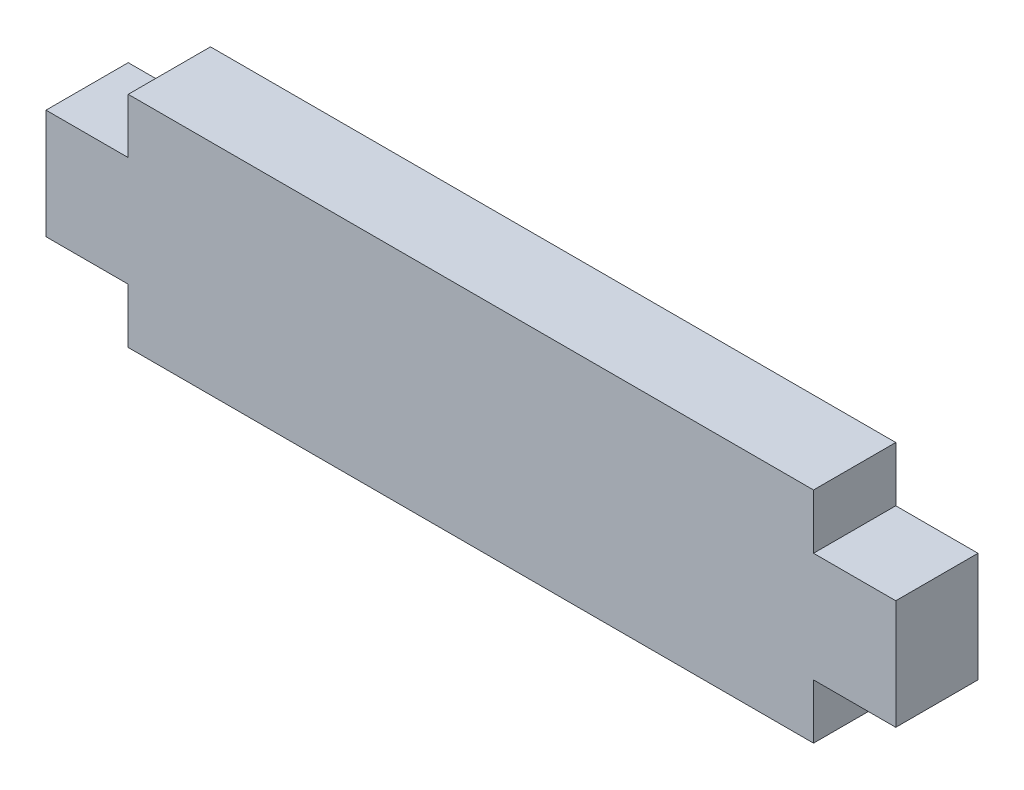
ISO-10303-21;
HEADER;
FILE_DESCRIPTION(('STEP AP214'),'2;1');
FILE_NAME('part.step','',(''),(''),'','','');
FILE_SCHEMA(('AUTOMOTIVE_DESIGN { 1 0 10303 214 1 1 1 1 }'));
ENDSEC;
DATA;
#1=APPLICATION_CONTEXT('core data for automotive mechanical design processes');
#2=APPLICATION_PROTOCOL_DEFINITION('international standard','automotive_design',2000,#1);
#3=PRODUCT_CONTEXT('',#1,'mechanical');
#4=PRODUCT('Part','Part','',(#3));
#5=PRODUCT_RELATED_PRODUCT_CATEGORY('part','',(#4));
#6=PRODUCT_DEFINITION_FORMATION('','',#4);
#7=PRODUCT_DEFINITION_CONTEXT('part definition',#1,'design');
#8=PRODUCT_DEFINITION('design','',#6,#7);
#9=PRODUCT_DEFINITION_SHAPE('','',#8);
#10=(LENGTH_UNIT() NAMED_UNIT(*) SI_UNIT(.MILLI.,.METRE.));
#11=(NAMED_UNIT(*) PLANE_ANGLE_UNIT() SI_UNIT($,.RADIAN.));
#12=(NAMED_UNIT(*) SI_UNIT($,.STERADIAN.) SOLID_ANGLE_UNIT());
#13=UNCERTAINTY_MEASURE_WITH_UNIT(LENGTH_MEASURE(1.E-05),#10,'distance_accuracy_value','');
#14=(GEOMETRIC_REPRESENTATION_CONTEXT(3) GLOBAL_UNCERTAINTY_ASSIGNED_CONTEXT((#13)) GLOBAL_UNIT_ASSIGNED_CONTEXT((#10,
#11,#12)) REPRESENTATION_CONTEXT('',''));
#15=CARTESIAN_POINT('',(0.,0.,0.));
#16=DIRECTION('',(0.,0.,1.));
#17=DIRECTION('',(1.,0.,0.));
#18=AXIS2_PLACEMENT_3D('',#15,#16,#17);
#19=CARTESIAN_POINT('',(50.,0.,6.));
#20=DIRECTION('',(0.,1.,0.));
#21=DIRECTION('',(0.,0.,1.));
#22=AXIS2_PLACEMENT_3D('',#19,#20,#21);
#23=PLANE('',#22);
#24=DIRECTION('',(1.,0.,0.));
#25=VECTOR('',#24,1.);
#26=CARTESIAN_POINT('',(50.,0.,0.));
#27=LINE('',#26,#25);
#28=CARTESIAN_POINT('',(0.,0.,0.));
#29=VERTEX_POINT('',#28);
#30=CARTESIAN_POINT('',(50.,0.,0.));
#31=VERTEX_POINT('',#30);
#32=EDGE_CURVE('E172',#29,#31,#27,.T.);
#33=ORIENTED_EDGE('',*,*,#32,.T.);
#34=DIRECTION('',(0.,0.,-1.));
#35=VECTOR('',#34,1.);
#36=CARTESIAN_POINT('',(50.,0.,6.));
#37=LINE('',#36,#35);
#38=CARTESIAN_POINT('',(50.,0.,6.));
#39=VERTEX_POINT('',#38);
#40=EDGE_CURVE('E11',#39,#31,#37,.T.);
#41=ORIENTED_EDGE('',*,*,#40,.F.);
#42=DIRECTION('',(1.,0.,0.));
#43=VECTOR('',#42,1.);
#44=CARTESIAN_POINT('',(50.,0.,6.));
#45=LINE('',#44,#43);
#46=CARTESIAN_POINT('',(0.,0.,6.));
#47=VERTEX_POINT('',#46);
#48=EDGE_CURVE('E205',#47,#39,#45,.T.);
#49=ORIENTED_EDGE('',*,*,#48,.F.);
#50=DIRECTION('',(0.,0.,-1.));
#51=VECTOR('',#50,1.);
#52=CARTESIAN_POINT('',(0.,0.,6.));
#53=LINE('',#52,#51);
#54=EDGE_CURVE('E168',#47,#29,#53,.T.);
#55=ORIENTED_EDGE('',*,*,#54,.T.);
#56=EDGE_LOOP('',(#33,#41,#49,#55));
#57=FACE_BOUND('',#56,.T.);
#58=ADVANCED_FACE('F45',(#57),#23,.F.);
#59=CARTESIAN_POINT('',(50.,4.,6.));
#60=DIRECTION('',(-1.,0.,0.));
#61=DIRECTION('',(0.,0.,1.));
#62=AXIS2_PLACEMENT_3D('',#59,#60,#61);
#63=PLANE('',#62);
#64=DIRECTION('',(0.,1.,0.));
#65=VECTOR('',#64,1.);
#66=CARTESIAN_POINT('',(50.,4.,0.));
#67=LINE('',#66,#65);
#68=CARTESIAN_POINT('',(50.,4.,0.));
#69=VERTEX_POINT('',#68);
#70=EDGE_CURVE('E175',#31,#69,#67,.T.);
#71=ORIENTED_EDGE('',*,*,#70,.T.);
#72=DIRECTION('',(0.,0.,-1.));
#73=VECTOR('',#72,1.);
#74=CARTESIAN_POINT('',(50.,4.,6.));
#75=LINE('',#74,#73);
#76=CARTESIAN_POINT('',(50.,4.,6.));
#77=VERTEX_POINT('',#76);
#78=EDGE_CURVE('E54',#77,#69,#75,.T.);
#79=ORIENTED_EDGE('',*,*,#78,.F.);
#80=DIRECTION('',(0.,1.,0.));
#81=VECTOR('',#80,1.);
#82=CARTESIAN_POINT('',(50.,4.,6.));
#83=LINE('',#82,#81);
#84=EDGE_CURVE('E117',#39,#77,#83,.T.);
#85=ORIENTED_EDGE('',*,*,#84,.F.);
#86=ORIENTED_EDGE('',*,*,#40,.T.);
#87=EDGE_LOOP('',(#71,#79,#85,#86));
#88=FACE_BOUND('',#87,.T.);
#89=ADVANCED_FACE('F297',(#88),#63,.F.);
#90=CARTESIAN_POINT('',(56.,4.,6.));
#91=DIRECTION('',(0.,1.,0.));
#92=DIRECTION('',(0.,0.,1.));
#93=AXIS2_PLACEMENT_3D('',#90,#91,#92);
#94=PLANE('',#93);
#95=DIRECTION('',(1.,0.,0.));
#96=VECTOR('',#95,1.);
#97=CARTESIAN_POINT('',(56.,4.,0.));
#98=LINE('',#97,#96);
#99=CARTESIAN_POINT('',(56.,4.,0.));
#100=VERTEX_POINT('',#99);
#101=EDGE_CURVE('E178',#69,#100,#98,.T.);
#102=ORIENTED_EDGE('',*,*,#101,.T.);
#103=DIRECTION('',(0.,0.,-1.));
#104=VECTOR('',#103,1.);
#105=CARTESIAN_POINT('',(56.,4.,6.));
#106=LINE('',#105,#104);
#107=CARTESIAN_POINT('',(56.,4.,6.));
#108=VERTEX_POINT('',#107);
#109=EDGE_CURVE('E232',#108,#100,#106,.T.);
#110=ORIENTED_EDGE('',*,*,#109,.F.);
#111=DIRECTION('',(1.,0.,0.));
#112=VECTOR('',#111,1.);
#113=CARTESIAN_POINT('',(56.,4.,6.));
#114=LINE('',#113,#112);
#115=EDGE_CURVE('E243',#77,#108,#114,.T.);
#116=ORIENTED_EDGE('',*,*,#115,.F.);
#117=ORIENTED_EDGE('',*,*,#78,.T.);
#118=EDGE_LOOP('',(#102,#110,#116,#117));
#119=FACE_BOUND('',#118,.T.);
#120=ADVANCED_FACE('F241',(#119),#94,.F.);
#121=CARTESIAN_POINT('',(56.,12.,6.));
#122=DIRECTION('',(-1.,0.,0.));
#123=DIRECTION('',(0.,0.,1.));
#124=AXIS2_PLACEMENT_3D('',#121,#122,#123);
#125=PLANE('',#124);
#126=DIRECTION('',(0.,1.,0.));
#127=VECTOR('',#126,1.);
#128=CARTESIAN_POINT('',(56.,12.,0.));
#129=LINE('',#128,#127);
#130=CARTESIAN_POINT('',(56.,12.,0.));
#131=VERTEX_POINT('',#130);
#132=EDGE_CURVE('E181',#100,#131,#129,.T.);
#133=ORIENTED_EDGE('',*,*,#132,.T.);
#134=DIRECTION('',(0.,0.,-1.));
#135=VECTOR('',#134,1.);
#136=CARTESIAN_POINT('',(56.,12.,6.));
#137=LINE('',#136,#135);
#138=CARTESIAN_POINT('',(56.,12.,6.));
#139=VERTEX_POINT('',#138);
#140=EDGE_CURVE('E228',#139,#131,#137,.T.);
#141=ORIENTED_EDGE('',*,*,#140,.F.);
#142=DIRECTION('',(0.,1.,0.));
#143=VECTOR('',#142,1.);
#144=CARTESIAN_POINT('',(56.,12.,6.));
#145=LINE('',#144,#143);
#146=EDGE_CURVE('E262',#108,#139,#145,.T.);
#147=ORIENTED_EDGE('',*,*,#146,.F.);
#148=ORIENTED_EDGE('',*,*,#109,.T.);
#149=EDGE_LOOP('',(#133,#141,#147,#148));
#150=FACE_BOUND('',#149,.T.);
#151=ADVANCED_FACE('F252',(#150),#125,.F.);
#152=CARTESIAN_POINT('',(50.,12.,6.));
#153=DIRECTION('',(0.,-1.,0.));
#154=DIRECTION('',(0.,0.,-1.));
#155=AXIS2_PLACEMENT_3D('',#152,#153,#154);
#156=PLANE('',#155);
#157=DIRECTION('',(-1.,0.,0.));
#158=VECTOR('',#157,1.);
#159=CARTESIAN_POINT('',(50.,12.,0.));
#160=LINE('',#159,#158);
#161=CARTESIAN_POINT('',(50.,12.,0.));
#162=VERTEX_POINT('',#161);
#163=EDGE_CURVE('E184',#131,#162,#160,.T.);
#164=ORIENTED_EDGE('',*,*,#163,.T.);
#165=DIRECTION('',(0.,0.,-1.));
#166=VECTOR('',#165,1.);
#167=CARTESIAN_POINT('',(50.,12.,6.));
#168=LINE('',#167,#166);
#169=CARTESIAN_POINT('',(50.,12.,6.));
#170=VERTEX_POINT('',#169);
#171=EDGE_CURVE('E224',#170,#162,#168,.T.);
#172=ORIENTED_EDGE('',*,*,#171,.F.);
#173=DIRECTION('',(-1.,0.,0.));
#174=VECTOR('',#173,1.);
#175=CARTESIAN_POINT('',(50.,12.,6.));
#176=LINE('',#175,#174);
#177=EDGE_CURVE('E258',#139,#170,#176,.T.);
#178=ORIENTED_EDGE('',*,*,#177,.F.);
#179=ORIENTED_EDGE('',*,*,#140,.T.);
#180=EDGE_LOOP('',(#164,#172,#178,#179));
#181=FACE_BOUND('',#180,.T.);
#182=ADVANCED_FACE('F256',(#181),#156,.F.);
#183=CARTESIAN_POINT('',(50.,16.,6.));
#184=DIRECTION('',(-1.,0.,0.));
#185=DIRECTION('',(0.,0.,1.));
#186=AXIS2_PLACEMENT_3D('',#183,#184,#185);
#187=PLANE('',#186);
#188=DIRECTION('',(0.,1.,0.));
#189=VECTOR('',#188,1.);
#190=CARTESIAN_POINT('',(50.,16.,0.));
#191=LINE('',#190,#189);
#192=CARTESIAN_POINT('',(50.,16.,0.));
#193=VERTEX_POINT('',#192);
#194=EDGE_CURVE('E187',#162,#193,#191,.T.);
#195=ORIENTED_EDGE('',*,*,#194,.T.);
#196=DIRECTION('',(0.,0.,-1.));
#197=VECTOR('',#196,1.);
#198=CARTESIAN_POINT('',(50.,16.,6.));
#199=LINE('',#198,#197);
#200=CARTESIAN_POINT('',(50.,16.,6.));
#201=VERTEX_POINT('',#200);
#202=EDGE_CURVE('E220',#201,#193,#199,.T.);
#203=ORIENTED_EDGE('',*,*,#202,.F.);
#204=DIRECTION('',(0.,1.,0.));
#205=VECTOR('',#204,1.);
#206=CARTESIAN_POINT('',(50.,16.,6.));
#207=LINE('',#206,#205);
#208=EDGE_CURVE('E261',#170,#201,#207,.T.);
#209=ORIENTED_EDGE('',*,*,#208,.F.);
#210=ORIENTED_EDGE('',*,*,#171,.T.);
#211=EDGE_LOOP('',(#195,#203,#209,#210));
#212=FACE_BOUND('',#211,.T.);
#213=ADVANCED_FACE('F308',(#212),#187,.F.);
#214=CARTESIAN_POINT('',(0.,16.,6.));
#215=DIRECTION('',(0.,-1.,0.));
#216=DIRECTION('',(0.,0.,-1.));
#217=AXIS2_PLACEMENT_3D('',#214,#215,#216);
#218=PLANE('',#217);
#219=DIRECTION('',(-1.,0.,0.));
#220=VECTOR('',#219,1.);
#221=CARTESIAN_POINT('',(0.,16.,0.));
#222=LINE('',#221,#220);
#223=CARTESIAN_POINT('',(0.,16.,0.));
#224=VERTEX_POINT('',#223);
#225=EDGE_CURVE('E190',#193,#224,#222,.T.);
#226=ORIENTED_EDGE('',*,*,#225,.T.);
#227=DIRECTION('',(0.,0.,-1.));
#228=VECTOR('',#227,1.);
#229=CARTESIAN_POINT('',(0.,16.,6.));
#230=LINE('',#229,#228);
#231=CARTESIAN_POINT('',(0.,16.,6.));
#232=VERTEX_POINT('',#231);
#233=EDGE_CURVE('E216',#232,#224,#230,.T.);
#234=ORIENTED_EDGE('',*,*,#233,.F.);
#235=DIRECTION('',(-1.,0.,0.));
#236=VECTOR('',#235,1.);
#237=CARTESIAN_POINT('',(0.,16.,6.));
#238=LINE('',#237,#236);
#239=EDGE_CURVE('E264',#201,#232,#238,.T.);
#240=ORIENTED_EDGE('',*,*,#239,.F.);
#241=ORIENTED_EDGE('',*,*,#202,.T.);
#242=EDGE_LOOP('',(#226,#234,#240,#241));
#243=FACE_BOUND('',#242,.T.);
#244=ADVANCED_FACE('F311',(#243),#218,.F.);
#245=CARTESIAN_POINT('',(0.,12.,6.));
#246=DIRECTION('',(1.,0.,0.));
#247=DIRECTION('',(0.,0.,-1.));
#248=AXIS2_PLACEMENT_3D('',#245,#246,#247);
#249=PLANE('',#248);
#250=DIRECTION('',(0.,-1.,0.));
#251=VECTOR('',#250,1.);
#252=CARTESIAN_POINT('',(0.,12.,0.));
#253=LINE('',#252,#251);
#254=CARTESIAN_POINT('',(0.,12.,0.));
#255=VERTEX_POINT('',#254);
#256=EDGE_CURVE('E193',#224,#255,#253,.T.);
#257=ORIENTED_EDGE('',*,*,#256,.T.);
#258=DIRECTION('',(0.,0.,-1.));
#259=VECTOR('',#258,1.);
#260=CARTESIAN_POINT('',(0.,12.,6.));
#261=LINE('',#260,#259);
#262=CARTESIAN_POINT('',(0.,12.,6.));
#263=VERTEX_POINT('',#262);
#264=EDGE_CURVE('E212',#263,#255,#261,.T.);
#265=ORIENTED_EDGE('',*,*,#264,.F.);
#266=DIRECTION('',(0.,-1.,0.));
#267=VECTOR('',#266,1.);
#268=CARTESIAN_POINT('',(0.,12.,6.));
#269=LINE('',#268,#267);
#270=EDGE_CURVE('E272',#232,#263,#269,.T.);
#271=ORIENTED_EDGE('',*,*,#270,.F.);
#272=ORIENTED_EDGE('',*,*,#233,.T.);
#273=EDGE_LOOP('',(#257,#265,#271,#272));
#274=FACE_BOUND('',#273,.T.);
#275=ADVANCED_FACE('F279',(#274),#249,.F.);
#276=CARTESIAN_POINT('',(-6.,12.,6.));
#277=DIRECTION('',(0.,-1.,0.));
#278=DIRECTION('',(0.,0.,-1.));
#279=AXIS2_PLACEMENT_3D('',#276,#277,#278);
#280=PLANE('',#279);
#281=DIRECTION('',(-1.,0.,0.));
#282=VECTOR('',#281,1.);
#283=CARTESIAN_POINT('',(-6.,12.,0.));
#284=LINE('',#283,#282);
#285=CARTESIAN_POINT('',(-6.,12.,0.));
#286=VERTEX_POINT('',#285);
#287=EDGE_CURVE('E196',#255,#286,#284,.T.);
#288=ORIENTED_EDGE('',*,*,#287,.T.);
#289=DIRECTION('',(0.,0.,-1.));
#290=VECTOR('',#289,1.);
#291=CARTESIAN_POINT('',(-6.,12.,6.));
#292=LINE('',#291,#290);
#293=CARTESIAN_POINT('',(-6.,12.,6.));
#294=VERTEX_POINT('',#293);
#295=EDGE_CURVE('E159',#294,#286,#292,.T.);
#296=ORIENTED_EDGE('',*,*,#295,.F.);
#297=DIRECTION('',(-1.,0.,0.));
#298=VECTOR('',#297,1.);
#299=CARTESIAN_POINT('',(-6.,12.,6.));
#300=LINE('',#299,#298);
#301=EDGE_CURVE('E148',#263,#294,#300,.T.);
#302=ORIENTED_EDGE('',*,*,#301,.F.);
#303=ORIENTED_EDGE('',*,*,#264,.T.);
#304=EDGE_LOOP('',(#288,#296,#302,#303));
#305=FACE_BOUND('',#304,.T.);
#306=ADVANCED_FACE('F283',(#305),#280,.F.);
#307=CARTESIAN_POINT('',(-6.,4.,6.));
#308=DIRECTION('',(1.,0.,0.));
#309=DIRECTION('',(0.,0.,-1.));
#310=AXIS2_PLACEMENT_3D('',#307,#308,#309);
#311=PLANE('',#310);
#312=DIRECTION('',(0.,-1.,0.));
#313=VECTOR('',#312,1.);
#314=CARTESIAN_POINT('',(-6.,4.,0.));
#315=LINE('',#314,#313);
#316=CARTESIAN_POINT('',(-6.,4.,0.));
#317=VERTEX_POINT('',#316);
#318=EDGE_CURVE('E157',#286,#317,#315,.T.);
#319=ORIENTED_EDGE('',*,*,#318,.T.);
#320=DIRECTION('',(0.,0.,-1.));
#321=VECTOR('',#320,1.);
#322=CARTESIAN_POINT('',(-6.,4.,6.));
#323=LINE('',#322,#321);
#324=CARTESIAN_POINT('',(-6.,4.,6.));
#325=VERTEX_POINT('',#324);
#326=EDGE_CURVE('E154',#325,#317,#323,.T.);
#327=ORIENTED_EDGE('',*,*,#326,.F.);
#328=DIRECTION('',(0.,-1.,0.));
#329=VECTOR('',#328,1.);
#330=CARTESIAN_POINT('',(-6.,4.,6.));
#331=LINE('',#330,#329);
#332=EDGE_CURVE('E142',#294,#325,#331,.T.);
#333=ORIENTED_EDGE('',*,*,#332,.F.);
#334=ORIENTED_EDGE('',*,*,#295,.T.);
#335=EDGE_LOOP('',(#319,#327,#333,#334));
#336=FACE_BOUND('',#335,.T.);
#337=ADVANCED_FACE('F155',(#336),#311,.F.);
#338=CARTESIAN_POINT('',(0.,4.,6.));
#339=DIRECTION('',(0.,1.,0.));
#340=DIRECTION('',(0.,0.,1.));
#341=AXIS2_PLACEMENT_3D('',#338,#339,#340);
#342=PLANE('',#341);
#343=DIRECTION('',(1.,0.,0.));
#344=VECTOR('',#343,1.);
#345=CARTESIAN_POINT('',(0.,4.,0.));
#346=LINE('',#345,#344);
#347=CARTESIAN_POINT('',(0.,4.,0.));
#348=VERTEX_POINT('',#347);
#349=EDGE_CURVE('E103',#317,#348,#346,.T.);
#350=ORIENTED_EDGE('',*,*,#349,.T.);
#351=DIRECTION('',(0.,0.,-1.));
#352=VECTOR('',#351,1.);
#353=CARTESIAN_POINT('',(0.,4.,6.));
#354=LINE('',#353,#352);
#355=CARTESIAN_POINT('',(0.,4.,6.));
#356=VERTEX_POINT('',#355);
#357=EDGE_CURVE('E160',#356,#348,#354,.T.);
#358=ORIENTED_EDGE('',*,*,#357,.F.);
#359=DIRECTION('',(1.,0.,0.));
#360=VECTOR('',#359,1.);
#361=CARTESIAN_POINT('',(0.,4.,6.));
#362=LINE('',#361,#360);
#363=EDGE_CURVE('E146',#325,#356,#362,.T.);
#364=ORIENTED_EDGE('',*,*,#363,.F.);
#365=ORIENTED_EDGE('',*,*,#326,.T.);
#366=EDGE_LOOP('',(#350,#358,#364,#365));
#367=FACE_BOUND('',#366,.T.);
#368=ADVANCED_FACE('F162',(#367),#342,.F.);
#369=CARTESIAN_POINT('',(0.,0.,6.));
#370=DIRECTION('',(1.,0.,0.));
#371=DIRECTION('',(0.,0.,-1.));
#372=AXIS2_PLACEMENT_3D('',#369,#370,#371);
#373=PLANE('',#372);
#374=DIRECTION('',(0.,-1.,0.));
#375=VECTOR('',#374,1.);
#376=CARTESIAN_POINT('',(0.,0.,0.));
#377=LINE('',#376,#375);
#378=EDGE_CURVE('E109',#348,#29,#377,.T.);
#379=ORIENTED_EDGE('',*,*,#378,.T.);
#380=ORIENTED_EDGE('',*,*,#54,.F.);
#381=DIRECTION('',(0.,-1.,0.));
#382=VECTOR('',#381,1.);
#383=CARTESIAN_POINT('',(0.,0.,6.));
#384=LINE('',#383,#382);
#385=EDGE_CURVE('E62',#356,#47,#384,.T.);
#386=ORIENTED_EDGE('',*,*,#385,.F.);
#387=ORIENTED_EDGE('',*,*,#357,.T.);
#388=EDGE_LOOP('',(#379,#380,#386,#387));
#389=FACE_BOUND('',#388,.T.);
#390=ADVANCED_FACE('F287',(#389),#373,.F.);
#391=CARTESIAN_POINT('',(0.,0.,6.));
#392=DIRECTION('',(0.,0.,-1.));
#393=DIRECTION('',(-1.,0.,0.));
#394=AXIS2_PLACEMENT_3D('',#391,#392,#393);
#395=PLANE('',#394);
#396=ORIENTED_EDGE('',*,*,#48,.T.);
#397=ORIENTED_EDGE('',*,*,#84,.T.);
#398=ORIENTED_EDGE('',*,*,#115,.T.);
#399=ORIENTED_EDGE('',*,*,#146,.T.);
#400=ORIENTED_EDGE('',*,*,#177,.T.);
#401=ORIENTED_EDGE('',*,*,#208,.T.);
#402=ORIENTED_EDGE('',*,*,#239,.T.);
#403=ORIENTED_EDGE('',*,*,#270,.T.);
#404=ORIENTED_EDGE('',*,*,#301,.T.);
#405=ORIENTED_EDGE('',*,*,#332,.T.);
#406=ORIENTED_EDGE('',*,*,#363,.T.);
#407=ORIENTED_EDGE('',*,*,#385,.T.);
#408=EDGE_LOOP('',(#396,#397,#398,#399,#400,#401,#402,#403,#404,#405,#406,#407));
#409=FACE_BOUND('',#408,.T.);
#410=ADVANCED_FACE('F144',(#409),#395,.F.);
#411=CARTESIAN_POINT('',(0.,0.,0.));
#412=DIRECTION('',(0.,0.,-1.));
#413=DIRECTION('',(-1.,0.,0.));
#414=AXIS2_PLACEMENT_3D('',#411,#412,#413);
#415=PLANE('',#414);
#416=ORIENTED_EDGE('',*,*,#32,.F.);
#417=ORIENTED_EDGE('',*,*,#378,.F.);
#418=ORIENTED_EDGE('',*,*,#349,.F.);
#419=ORIENTED_EDGE('',*,*,#318,.F.);
#420=ORIENTED_EDGE('',*,*,#287,.F.);
#421=ORIENTED_EDGE('',*,*,#256,.F.);
#422=ORIENTED_EDGE('',*,*,#225,.F.);
#423=ORIENTED_EDGE('',*,*,#194,.F.);
#424=ORIENTED_EDGE('',*,*,#163,.F.);
#425=ORIENTED_EDGE('',*,*,#132,.F.);
#426=ORIENTED_EDGE('',*,*,#101,.F.);
#427=ORIENTED_EDGE('',*,*,#70,.F.);
#428=EDGE_LOOP('',(#416,#417,#418,#419,#420,#421,#422,#423,#424,#425,#426,#427));
#429=FACE_BOUND('',#428,.T.);
#430=ADVANCED_FACE('F247',(#429),#415,.T.);
#431=CLOSED_SHELL('',(#58,#89,#120,#151,#182,#213,#244,#275,#306,#337,#368,#390,#410,#430));
#432=MANIFOLD_SOLID_BREP('B2',#431);
#433=ADVANCED_BREP_SHAPE_REPRESENTATION('',(#18,#432),#14);
#434=SHAPE_DEFINITION_REPRESENTATION(#9,#433);
ENDSEC;
END-ISO-10303-21;
